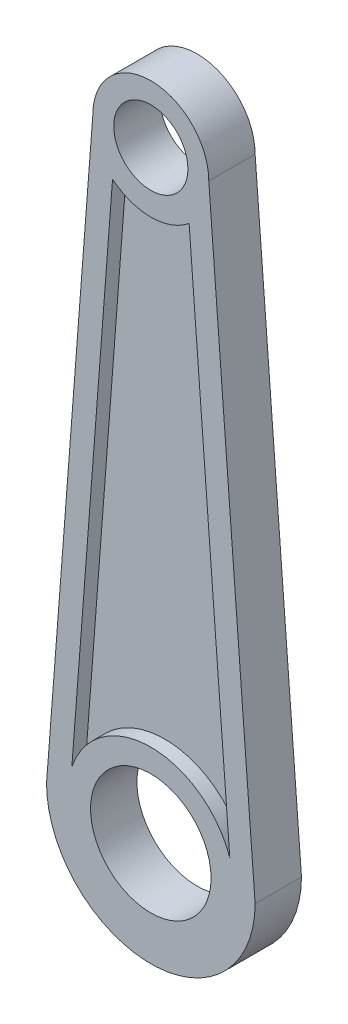
ISO-10303-21;
HEADER;
FILE_DESCRIPTION(('STEP AP214'),'2;1');
FILE_NAME('part.step','',(''),(''),'','','');
FILE_SCHEMA(('AUTOMOTIVE_DESIGN { 1 0 10303 214 1 1 1 1 }'));
ENDSEC;
DATA;
#1=APPLICATION_CONTEXT('core data for automotive mechanical design processes');
#2=APPLICATION_PROTOCOL_DEFINITION('international standard','automotive_design',2000,#1);
#3=PRODUCT_CONTEXT('',#1,'mechanical');
#4=PRODUCT('Part','Part','',(#3));
#5=PRODUCT_RELATED_PRODUCT_CATEGORY('part','',(#4));
#6=PRODUCT_DEFINITION_FORMATION('','',#4);
#7=PRODUCT_DEFINITION_CONTEXT('part definition',#1,'design');
#8=PRODUCT_DEFINITION('design','',#6,#7);
#9=PRODUCT_DEFINITION_SHAPE('','',#8);
#10=(LENGTH_UNIT() NAMED_UNIT(*) SI_UNIT(.MILLI.,.METRE.));
#11=(NAMED_UNIT(*) PLANE_ANGLE_UNIT() SI_UNIT($,.RADIAN.));
#12=(NAMED_UNIT(*) SI_UNIT($,.STERADIAN.) SOLID_ANGLE_UNIT());
#13=UNCERTAINTY_MEASURE_WITH_UNIT(LENGTH_MEASURE(1.E-05),#10,'distance_accuracy_value','');
#14=(GEOMETRIC_REPRESENTATION_CONTEXT(3) GLOBAL_UNCERTAINTY_ASSIGNED_CONTEXT((#13)) GLOBAL_UNIT_ASSIGNED_CONTEXT((#10,
#11,#12)) REPRESENTATION_CONTEXT('',''));
#15=CARTESIAN_POINT('',(0.,0.,0.));
#16=DIRECTION('',(0.,0.,1.));
#17=DIRECTION('',(1.,0.,0.));
#18=AXIS2_PLACEMENT_3D('',#15,#16,#17);
#19=CARTESIAN_POINT('',(0.,0.,5.));
#20=DIRECTION('',(0.,0.,1.));
#21=DIRECTION('',(1.,0.,0.));
#22=AXIS2_PLACEMENT_3D('',#19,#20,#21);
#23=PLANE('',#22);
#24=CARTESIAN_POINT('',(0.,130.,5.));
#25=DIRECTION('',(0.,0.,1.));
#26=DIRECTION('',(1.,0.,0.));
#27=AXIS2_PLACEMENT_3D('',#24,#25,#26);
#28=CIRCLE('',#27,8.);
#29=CARTESIAN_POINT('',(8.,130.,5.));
#30=VERTEX_POINT('',#29);
#31=EDGE_CURVE('E221',#30,#30,#28,.T.);
#32=ORIENTED_EDGE('',*,*,#31,.F.);
#33=EDGE_LOOP('',(#32));
#34=FACE_BOUND('',#33,.T.);
#35=CARTESIAN_POINT('',(0.,130.,5.));
#36=DIRECTION('',(0.,0.,1.));
#37=DIRECTION('',(1.,0.,0.));
#38=AXIS2_PLACEMENT_3D('',#35,#36,#37);
#39=CIRCLE('',#38,12.5);
#40=CARTESIAN_POINT('',(12.5,130.,5.));
#41=VERTEX_POINT('',#40);
#42=CARTESIAN_POINT('',(-12.5,130.,5.));
#43=VERTEX_POINT('',#42);
#44=EDGE_CURVE('E225',#41,#43,#39,.T.);
#45=ORIENTED_EDGE('',*,*,#44,.T.);
#46=DIRECTION('',(0.076696498884737,0.997054485501582,0.));
#47=VECTOR('',#46,1.);
#48=CARTESIAN_POINT('',(-22.3676470588235,1.72058823529412,5.));
#49=LINE('',#48,#47);
#50=CARTESIAN_POINT('',(-22.5,0.,5.));
#51=VERTEX_POINT('',#50);
#52=EDGE_CURVE('E229',#51,#43,#49,.T.);
#53=ORIENTED_EDGE('',*,*,#52,.F.);
#54=CARTESIAN_POINT('',(0.,0.,5.));
#55=DIRECTION('',(0.,0.,1.));
#56=DIRECTION('',(1.,0.,0.));
#57=AXIS2_PLACEMENT_3D('',#54,#55,#56);
#58=CIRCLE('',#57,22.5);
#59=CARTESIAN_POINT('',(22.5,0.,5.));
#60=VERTEX_POINT('',#59);
#61=EDGE_CURVE('E233',#51,#60,#58,.T.);
#62=ORIENTED_EDGE('',*,*,#61,.T.);
#63=DIRECTION('',(0.076696498884737,-0.997054485501582,0.));
#64=VECTOR('',#63,1.);
#65=CARTESIAN_POINT('',(22.3676470588235,1.72058823529412,5.));
#66=LINE('',#65,#64);
#67=EDGE_CURVE('E236',#41,#60,#66,.T.);
#68=ORIENTED_EDGE('',*,*,#67,.F.);
#69=EDGE_LOOP('',(#45,#53,#62,#68));
#70=FACE_BOUND('',#69,.T.);
#71=CARTESIAN_POINT('',(0.,0.,5.));
#72=DIRECTION('',(0.,0.,1.));
#73=DIRECTION('',(1.,0.,0.));
#74=AXIS2_PLACEMENT_3D('',#71,#72,#73);
#75=CIRCLE('',#74,13.);
#76=CARTESIAN_POINT('',(13.,0.,5.));
#77=VERTEX_POINT('',#76);
#78=EDGE_CURVE('E240',#77,#77,#75,.T.);
#79=ORIENTED_EDGE('',*,*,#78,.F.);
#80=EDGE_LOOP('',(#79));
#81=FACE_BOUND('',#80,.T.);
#82=DIRECTION('',(-0.076696498884737,-0.997054485501582,0.));
#83=VECTOR('',#82,1.);
#84=CARTESIAN_POINT('',(-8.25757800432226,119.959461891784,5.));
#85=LINE('',#84,#83);
#86=CARTESIAN_POINT('',(-8.25757800432226,119.959461891784,5.));
#87=VERTEX_POINT('',#86);
#88=CARTESIAN_POINT('',(-17.0388188270094,5.80333119685157,5.));
#89=VERTEX_POINT('',#88);
#90=EDGE_CURVE('E184',#87,#89,#85,.T.);
#91=ORIENTED_EDGE('',*,*,#90,.F.);
#92=CARTESIAN_POINT('',(0.,130.,5.));
#93=DIRECTION('',(0.,0.,1.));
#94=DIRECTION('',(1.,0.,0.));
#95=AXIS2_PLACEMENT_3D('',#92,#93,#94);
#96=CIRCLE('',#95,13.);
#97=CARTESIAN_POINT('',(8.25757800432226,119.959461891784,5.));
#98=VERTEX_POINT('',#97);
#99=EDGE_CURVE('E65',#87,#98,#96,.T.);
#100=ORIENTED_EDGE('',*,*,#99,.T.);
#101=DIRECTION('',(-0.076696498884737,0.997054485501582,0.));
#102=VECTOR('',#101,1.);
#103=CARTESIAN_POINT('',(17.0388188270094,5.80333119685158,5.));
#104=LINE('',#103,#102);
#105=CARTESIAN_POINT('',(17.0388188270094,5.80333119685158,5.));
#106=VERTEX_POINT('',#105);
#107=EDGE_CURVE('E198',#106,#98,#104,.T.);
#108=ORIENTED_EDGE('',*,*,#107,.F.);
#109=CARTESIAN_POINT('',(0.,0.,5.));
#110=DIRECTION('',(0.,0.,1.));
#111=DIRECTION('',(1.,0.,0.));
#112=AXIS2_PLACEMENT_3D('',#109,#110,#111);
#113=CIRCLE('',#112,18.);
#114=EDGE_CURVE('E202',#106,#89,#113,.T.);
#115=ORIENTED_EDGE('',*,*,#114,.T.);
#116=EDGE_LOOP('',(#91,#100,#108,#115));
#117=FACE_BOUND('',#116,.T.);
#118=ADVANCED_FACE('F41',(#34,#70,#81,#117),#23,.T.);
#119=CARTESIAN_POINT('',(0.,130.,5.));
#120=DIRECTION('',(0.,0.,-1.));
#121=DIRECTION('',(-1.,0.,0.));
#122=AXIS2_PLACEMENT_3D('',#119,#120,#121);
#123=CYLINDRICAL_SURFACE('',#122,12.5);
#124=CARTESIAN_POINT('',(0.,130.,-5.));
#125=DIRECTION('',(0.,0.,1.));
#126=DIRECTION('',(1.,0.,0.));
#127=AXIS2_PLACEMENT_3D('',#124,#125,#126);
#128=CIRCLE('',#127,12.5);
#129=CARTESIAN_POINT('',(12.5,130.,-5.));
#130=VERTEX_POINT('',#129);
#131=CARTESIAN_POINT('',(-12.5,130.,-5.));
#132=VERTEX_POINT('',#131);
#133=EDGE_CURVE('E248',#130,#132,#128,.T.);
#134=ORIENTED_EDGE('',*,*,#133,.T.);
#135=DIRECTION('',(0.,0.,-1.));
#136=VECTOR('',#135,1.);
#137=CARTESIAN_POINT('',(-12.5,130.,5.));
#138=LINE('',#137,#136);
#139=EDGE_CURVE('E11',#43,#132,#138,.T.);
#140=ORIENTED_EDGE('',*,*,#139,.F.);
#141=ORIENTED_EDGE('',*,*,#44,.F.);
#142=DIRECTION('',(0.,0.,-1.));
#143=VECTOR('',#142,1.);
#144=CARTESIAN_POINT('',(12.5,130.,5.));
#145=LINE('',#144,#143);
#146=EDGE_CURVE('E244',#41,#130,#145,.T.);
#147=ORIENTED_EDGE('',*,*,#146,.T.);
#148=EDGE_LOOP('',(#134,#140,#141,#147));
#149=FACE_BOUND('',#148,.T.);
#150=ADVANCED_FACE('F289',(#149),#123,.T.);
#151=CARTESIAN_POINT('',(-22.3676470588235,1.72058823529412,5.));
#152=DIRECTION('',(-0.997054485501582,0.076696498884737,0.));
#153=DIRECTION('',(-0.076696498884737,-0.997054485501582,0.));
#154=AXIS2_PLACEMENT_3D('',#151,#152,#153);
#155=PLANE('',#154);
#156=DIRECTION('',(0.076696498884737,0.997054485501582,0.));
#157=VECTOR('',#156,1.);
#158=CARTESIAN_POINT('',(-22.3676470588235,1.72058823529412,-5.));
#159=LINE('',#158,#157);
#160=CARTESIAN_POINT('',(-22.5,0.,-5.));
#161=VERTEX_POINT('',#160);
#162=EDGE_CURVE('E252',#161,#132,#159,.T.);
#163=ORIENTED_EDGE('',*,*,#162,.F.);
#164=DIRECTION('',(0.,0.,-1.));
#165=VECTOR('',#164,1.);
#166=CARTESIAN_POINT('',(-22.5,0.,5.));
#167=LINE('',#166,#165);
#168=EDGE_CURVE('E50',#51,#161,#167,.T.);
#169=ORIENTED_EDGE('',*,*,#168,.F.);
#170=ORIENTED_EDGE('',*,*,#52,.T.);
#171=ORIENTED_EDGE('',*,*,#139,.T.);
#172=EDGE_LOOP('',(#163,#169,#170,#171));
#173=FACE_BOUND('',#172,.T.);
#174=ADVANCED_FACE('F285',(#173),#155,.T.);
#175=CARTESIAN_POINT('',(0.,0.,5.));
#176=DIRECTION('',(0.,0.,-1.));
#177=DIRECTION('',(-1.,0.,0.));
#178=AXIS2_PLACEMENT_3D('',#175,#176,#177);
#179=CYLINDRICAL_SURFACE('',#178,22.5);
#180=CARTESIAN_POINT('',(0.,0.,-5.));
#181=DIRECTION('',(0.,0.,1.));
#182=DIRECTION('',(1.,0.,0.));
#183=AXIS2_PLACEMENT_3D('',#180,#181,#182);
#184=CIRCLE('',#183,22.5);
#185=CARTESIAN_POINT('',(22.5,0.,-5.));
#186=VERTEX_POINT('',#185);
#187=EDGE_CURVE('E256',#161,#186,#184,.T.);
#188=ORIENTED_EDGE('',*,*,#187,.T.);
#189=DIRECTION('',(0.,0.,-1.));
#190=VECTOR('',#189,1.);
#191=CARTESIAN_POINT('',(22.5,0.,5.));
#192=LINE('',#191,#190);
#193=EDGE_CURVE('E269',#60,#186,#192,.T.);
#194=ORIENTED_EDGE('',*,*,#193,.F.);
#195=ORIENTED_EDGE('',*,*,#61,.F.);
#196=ORIENTED_EDGE('',*,*,#168,.T.);
#197=EDGE_LOOP('',(#188,#194,#195,#196));
#198=FACE_BOUND('',#197,.T.);
#199=ADVANCED_FACE('F275',(#198),#179,.T.);
#200=CARTESIAN_POINT('',(22.3676470588235,1.72058823529412,5.));
#201=DIRECTION('',(0.997054485501582,0.076696498884737,0.));
#202=DIRECTION('',(-0.076696498884737,0.997054485501582,0.));
#203=AXIS2_PLACEMENT_3D('',#200,#201,#202);
#204=PLANE('',#203);
#205=DIRECTION('',(0.076696498884737,-0.997054485501582,0.));
#206=VECTOR('',#205,1.);
#207=CARTESIAN_POINT('',(22.3676470588235,1.72058823529412,-5.));
#208=LINE('',#207,#206);
#209=EDGE_CURVE('E260',#130,#186,#208,.T.);
#210=ORIENTED_EDGE('',*,*,#209,.F.);
#211=ORIENTED_EDGE('',*,*,#146,.F.);
#212=ORIENTED_EDGE('',*,*,#67,.T.);
#213=ORIENTED_EDGE('',*,*,#193,.T.);
#214=EDGE_LOOP('',(#210,#211,#212,#213));
#215=FACE_BOUND('',#214,.T.);
#216=ADVANCED_FACE('F291',(#215),#204,.T.);
#217=CARTESIAN_POINT('',(0.,130.,5.));
#218=DIRECTION('',(0.,0.,-1.));
#219=DIRECTION('',(-1.,0.,0.));
#220=AXIS2_PLACEMENT_3D('',#217,#218,#219);
#221=CYLINDRICAL_SURFACE('',#220,8.);
#222=ORIENTED_EDGE('',*,*,#31,.T.);
#223=EDGE_LOOP('',(#222));
#224=FACE_BOUND('',#223,.T.);
#225=CARTESIAN_POINT('',(0.,130.,-5.));
#226=DIRECTION('',(0.,0.,1.));
#227=DIRECTION('',(1.,0.,0.));
#228=AXIS2_PLACEMENT_3D('',#225,#226,#227);
#229=CIRCLE('',#228,8.);
#230=CARTESIAN_POINT('',(8.,130.,-5.));
#231=VERTEX_POINT('',#230);
#232=EDGE_CURVE('E220',#231,#231,#229,.T.);
#233=ORIENTED_EDGE('',*,*,#232,.F.);
#234=EDGE_LOOP('',(#233));
#235=FACE_BOUND('',#234,.T.);
#236=ADVANCED_FACE('F43',(#224,#235),#221,.F.);
#237=CARTESIAN_POINT('',(0.,0.,5.));
#238=DIRECTION('',(0.,0.,-1.));
#239=DIRECTION('',(-1.,0.,0.));
#240=AXIS2_PLACEMENT_3D('',#237,#238,#239);
#241=CYLINDRICAL_SURFACE('',#240,13.);
#242=ORIENTED_EDGE('',*,*,#78,.T.);
#243=EDGE_LOOP('',(#242));
#244=FACE_BOUND('',#243,.T.);
#245=CARTESIAN_POINT('',(0.,0.,-5.));
#246=DIRECTION('',(0.,0.,1.));
#247=DIRECTION('',(1.,0.,0.));
#248=AXIS2_PLACEMENT_3D('',#245,#246,#247);
#249=CIRCLE('',#248,13.);
#250=CARTESIAN_POINT('',(13.,0.,-5.));
#251=VERTEX_POINT('',#250);
#252=EDGE_CURVE('E226',#251,#251,#249,.T.);
#253=ORIENTED_EDGE('',*,*,#252,.F.);
#254=EDGE_LOOP('',(#253));
#255=FACE_BOUND('',#254,.T.);
#256=ADVANCED_FACE('F332',(#244,#255),#241,.F.);
#257=CARTESIAN_POINT('',(0.,0.,-5.));
#258=DIRECTION('',(0.,0.,1.));
#259=DIRECTION('',(1.,0.,0.));
#260=AXIS2_PLACEMENT_3D('',#257,#258,#259);
#261=PLANE('',#260);
#262=DIRECTION('',(-0.076696498884737,0.997054485501582,0.));
#263=VECTOR('',#262,1.);
#264=CARTESIAN_POINT('',(17.0388188270094,5.80333119685158,-5.));
#265=LINE('',#264,#263);
#266=CARTESIAN_POINT('',(17.0388188270094,5.80333119685158,-5.));
#267=VERTEX_POINT('',#266);
#268=CARTESIAN_POINT('',(8.25757800432225,119.959461891784,-5.));
#269=VERTEX_POINT('',#268);
#270=EDGE_CURVE('E154',#267,#269,#265,.T.);
#271=ORIENTED_EDGE('',*,*,#270,.T.);
#272=CARTESIAN_POINT('',(0.,130.,-5.));
#273=DIRECTION('',(0.,0.,1.));
#274=DIRECTION('',(1.,0.,0.));
#275=AXIS2_PLACEMENT_3D('',#272,#273,#274);
#276=CIRCLE('',#275,13.);
#277=CARTESIAN_POINT('',(-8.25757800432226,119.959461891784,-5.));
#278=VERTEX_POINT('',#277);
#279=EDGE_CURVE('E57',#278,#269,#276,.T.);
#280=ORIENTED_EDGE('',*,*,#279,.F.);
#281=DIRECTION('',(-0.076696498884737,-0.997054485501582,0.));
#282=VECTOR('',#281,1.);
#283=CARTESIAN_POINT('',(-8.25757800432226,119.959461891784,-5.));
#284=LINE('',#283,#282);
#285=CARTESIAN_POINT('',(-17.0388188270094,5.80333119685157,-5.));
#286=VERTEX_POINT('',#285);
#287=EDGE_CURVE('E136',#278,#286,#284,.T.);
#288=ORIENTED_EDGE('',*,*,#287,.T.);
#289=CARTESIAN_POINT('',(0.,0.,-5.));
#290=DIRECTION('',(0.,0.,1.));
#291=DIRECTION('',(1.,0.,0.));
#292=AXIS2_PLACEMENT_3D('',#289,#290,#291);
#293=CIRCLE('',#292,18.);
#294=EDGE_CURVE('E158',#267,#286,#293,.T.);
#295=ORIENTED_EDGE('',*,*,#294,.F.);
#296=EDGE_LOOP('',(#271,#280,#288,#295));
#297=FACE_BOUND('',#296,.T.);
#298=ORIENTED_EDGE('',*,*,#232,.T.);
#299=EDGE_LOOP('',(#298));
#300=FACE_BOUND('',#299,.T.);
#301=ORIENTED_EDGE('',*,*,#133,.F.);
#302=ORIENTED_EDGE('',*,*,#209,.T.);
#303=ORIENTED_EDGE('',*,*,#187,.F.);
#304=ORIENTED_EDGE('',*,*,#162,.T.);
#305=EDGE_LOOP('',(#301,#302,#303,#304));
#306=FACE_BOUND('',#305,.T.);
#307=ORIENTED_EDGE('',*,*,#252,.T.);
#308=EDGE_LOOP('',(#307));
#309=FACE_BOUND('',#308,.T.);
#310=ADVANCED_FACE('F282',(#297,#300,#306,#309),#261,.F.);
#311=CARTESIAN_POINT('',(0.,130.,2.));
#312=DIRECTION('',(0.,0.,1.));
#313=DIRECTION('',(1.,0.,0.));
#314=AXIS2_PLACEMENT_3D('',#311,#312,#313);
#315=CYLINDRICAL_SURFACE('',#314,13.);
#316=ORIENTED_EDGE('',*,*,#99,.F.);
#317=DIRECTION('',(0.,0.,1.));
#318=VECTOR('',#317,1.);
#319=CARTESIAN_POINT('',(-8.25757800432226,119.959461891784,2.));
#320=LINE('',#319,#318);
#321=CARTESIAN_POINT('',(-8.25757800432226,119.959461891784,2.));
#322=VERTEX_POINT('',#321);
#323=EDGE_CURVE('E195',#322,#87,#320,.T.);
#324=ORIENTED_EDGE('',*,*,#323,.F.);
#325=CARTESIAN_POINT('',(0.,130.,2.));
#326=DIRECTION('',(0.,0.,1.));
#327=DIRECTION('',(1.,0.,0.));
#328=AXIS2_PLACEMENT_3D('',#325,#326,#327);
#329=CIRCLE('',#328,13.);
#330=CARTESIAN_POINT('',(8.25757800432226,119.959461891784,2.));
#331=VERTEX_POINT('',#330);
#332=EDGE_CURVE('E180',#322,#331,#329,.T.);
#333=ORIENTED_EDGE('',*,*,#332,.T.);
#334=DIRECTION('',(0.,0.,1.));
#335=VECTOR('',#334,1.);
#336=CARTESIAN_POINT('',(8.25757800432226,119.959461891784,2.));
#337=LINE('',#336,#335);
#338=EDGE_CURVE('E217',#331,#98,#337,.T.);
#339=ORIENTED_EDGE('',*,*,#338,.T.);
#340=EDGE_LOOP('',(#316,#324,#333,#339));
#341=FACE_BOUND('',#340,.T.);
#342=ADVANCED_FACE('F308',(#341),#315,.T.);
#343=CARTESIAN_POINT('',(17.0388188270094,5.80333119685158,2.));
#344=DIRECTION('',(0.997054485501582,0.076696498884737,0.));
#345=DIRECTION('',(-0.076696498884737,0.997054485501582,0.));
#346=AXIS2_PLACEMENT_3D('',#343,#344,#345);
#347=PLANE('',#346);
#348=ORIENTED_EDGE('',*,*,#107,.T.);
#349=ORIENTED_EDGE('',*,*,#338,.F.);
#350=DIRECTION('',(-0.076696498884737,0.997054485501582,0.));
#351=VECTOR('',#350,1.);
#352=CARTESIAN_POINT('',(17.0388188270094,5.80333119685158,2.));
#353=LINE('',#352,#351);
#354=CARTESIAN_POINT('',(17.0388188270094,5.80333119685158,2.));
#355=VERTEX_POINT('',#354);
#356=EDGE_CURVE('E183',#355,#331,#353,.T.);
#357=ORIENTED_EDGE('',*,*,#356,.F.);
#358=DIRECTION('',(0.,0.,1.));
#359=VECTOR('',#358,1.);
#360=CARTESIAN_POINT('',(17.0388188270094,5.80333119685158,2.));
#361=LINE('',#360,#359);
#362=EDGE_CURVE('E214',#355,#106,#361,.T.);
#363=ORIENTED_EDGE('',*,*,#362,.T.);
#364=EDGE_LOOP('',(#348,#349,#357,#363));
#365=FACE_BOUND('',#364,.T.);
#366=ADVANCED_FACE('F315',(#365),#347,.F.);
#367=CARTESIAN_POINT('',(0.,0.,2.));
#368=DIRECTION('',(0.,0.,1.));
#369=DIRECTION('',(1.,0.,0.));
#370=AXIS2_PLACEMENT_3D('',#367,#368,#369);
#371=CYLINDRICAL_SURFACE('',#370,18.);
#372=ORIENTED_EDGE('',*,*,#114,.F.);
#373=ORIENTED_EDGE('',*,*,#362,.F.);
#374=CARTESIAN_POINT('',(0.,0.,2.));
#375=DIRECTION('',(0.,0.,1.));
#376=DIRECTION('',(1.,0.,0.));
#377=AXIS2_PLACEMENT_3D('',#374,#375,#376);
#378=CIRCLE('',#377,18.);
#379=CARTESIAN_POINT('',(-17.0388188270094,5.80333119685157,2.));
#380=VERTEX_POINT('',#379);
#381=EDGE_CURVE('E188',#355,#380,#378,.T.);
#382=ORIENTED_EDGE('',*,*,#381,.T.);
#383=DIRECTION('',(0.,0.,1.));
#384=VECTOR('',#383,1.);
#385=CARTESIAN_POINT('',(-17.0388188270094,5.80333119685157,2.));
#386=LINE('',#385,#384);
#387=EDGE_CURVE('E211',#380,#89,#386,.T.);
#388=ORIENTED_EDGE('',*,*,#387,.T.);
#389=EDGE_LOOP('',(#372,#373,#382,#388));
#390=FACE_BOUND('',#389,.T.);
#391=ADVANCED_FACE('F317',(#390),#371,.T.);
#392=CARTESIAN_POINT('',(-8.25757800432226,119.959461891784,2.));
#393=DIRECTION('',(-0.997054485501581,0.076696498884737,0.));
#394=DIRECTION('',(-0.076696498884737,-0.997054485501582,0.));
#395=AXIS2_PLACEMENT_3D('',#392,#393,#394);
#396=PLANE('',#395);
#397=ORIENTED_EDGE('',*,*,#90,.T.);
#398=ORIENTED_EDGE('',*,*,#387,.F.);
#399=DIRECTION('',(-0.076696498884737,-0.997054485501582,0.));
#400=VECTOR('',#399,1.);
#401=CARTESIAN_POINT('',(-8.25757800432226,119.959461891784,2.));
#402=LINE('',#401,#400);
#403=EDGE_CURVE('E191',#322,#380,#402,.T.);
#404=ORIENTED_EDGE('',*,*,#403,.F.);
#405=ORIENTED_EDGE('',*,*,#323,.T.);
#406=EDGE_LOOP('',(#397,#398,#404,#405));
#407=FACE_BOUND('',#406,.T.);
#408=ADVANCED_FACE('F305',(#407),#396,.F.);
#409=CARTESIAN_POINT('',(0.,130.,2.));
#410=DIRECTION('',(0.,0.,1.));
#411=DIRECTION('',(1.,0.,0.));
#412=AXIS2_PLACEMENT_3D('',#409,#410,#411);
#413=PLANE('',#412);
#414=ORIENTED_EDGE('',*,*,#332,.F.);
#415=ORIENTED_EDGE('',*,*,#403,.T.);
#416=ORIENTED_EDGE('',*,*,#381,.F.);
#417=ORIENTED_EDGE('',*,*,#356,.T.);
#418=EDGE_LOOP('',(#414,#415,#416,#417));
#419=FACE_BOUND('',#418,.T.);
#420=ADVANCED_FACE('F311',(#419),#413,.T.);
#421=CARTESIAN_POINT('',(0.,130.,-2.));
#422=DIRECTION('',(0.,0.,-1.));
#423=DIRECTION('',(-1.,0.,0.));
#424=AXIS2_PLACEMENT_3D('',#421,#422,#423);
#425=CYLINDRICAL_SURFACE('',#424,13.);
#426=ORIENTED_EDGE('',*,*,#279,.T.);
#427=DIRECTION('',(0.,0.,-1.));
#428=VECTOR('',#427,1.);
#429=CARTESIAN_POINT('',(8.25757800432226,119.959461891784,-2.));
#430=LINE('',#429,#428);
#431=CARTESIAN_POINT('',(8.25757800432226,119.959461891784,-2.));
#432=VERTEX_POINT('',#431);
#433=EDGE_CURVE('E152',#432,#269,#430,.T.);
#434=ORIENTED_EDGE('',*,*,#433,.F.);
#435=CARTESIAN_POINT('',(0.,130.,-2.));
#436=DIRECTION('',(0.,0.,1.));
#437=DIRECTION('',(1.,0.,0.));
#438=AXIS2_PLACEMENT_3D('',#435,#436,#437);
#439=CIRCLE('',#438,13.);
#440=CARTESIAN_POINT('',(-8.25757800432226,119.959461891784,-2.));
#441=VERTEX_POINT('',#440);
#442=EDGE_CURVE('E146',#441,#432,#439,.T.);
#443=ORIENTED_EDGE('',*,*,#442,.F.);
#444=DIRECTION('',(0.,0.,-1.));
#445=VECTOR('',#444,1.);
#446=CARTESIAN_POINT('',(-8.25757800432226,119.959461891784,-2.));
#447=LINE('',#446,#445);
#448=EDGE_CURVE('E130',#441,#278,#447,.T.);
#449=ORIENTED_EDGE('',*,*,#448,.T.);
#450=EDGE_LOOP('',(#426,#434,#443,#449));
#451=FACE_BOUND('',#450,.T.);
#452=ADVANCED_FACE('F151',(#451),#425,.T.);
#453=CARTESIAN_POINT('',(-8.25757800432226,119.959461891784,-2.));
#454=DIRECTION('',(0.997054485501581,-0.076696498884737,0.));
#455=DIRECTION('',(0.076696498884737,0.997054485501582,0.));
#456=AXIS2_PLACEMENT_3D('',#453,#454,#455);
#457=PLANE('',#456);
#458=ORIENTED_EDGE('',*,*,#287,.F.);
#459=ORIENTED_EDGE('',*,*,#448,.F.);
#460=DIRECTION('',(-0.076696498884737,-0.997054485501582,0.));
#461=VECTOR('',#460,1.);
#462=CARTESIAN_POINT('',(-8.25757800432226,119.959461891784,-2.));
#463=LINE('',#462,#461);
#464=CARTESIAN_POINT('',(-17.0388188270094,5.80333119685157,-2.));
#465=VERTEX_POINT('',#464);
#466=EDGE_CURVE('E133',#441,#465,#463,.T.);
#467=ORIENTED_EDGE('',*,*,#466,.T.);
#468=DIRECTION('',(0.,0.,-1.));
#469=VECTOR('',#468,1.);
#470=CARTESIAN_POINT('',(-17.0388188270094,5.80333119685157,-2.));
#471=LINE('',#470,#469);
#472=EDGE_CURVE('E139',#465,#286,#471,.T.);
#473=ORIENTED_EDGE('',*,*,#472,.T.);
#474=EDGE_LOOP('',(#458,#459,#467,#473));
#475=FACE_BOUND('',#474,.T.);
#476=ADVANCED_FACE('F132',(#475),#457,.T.);
#477=CARTESIAN_POINT('',(0.,0.,-2.));
#478=DIRECTION('',(0.,0.,-1.));
#479=DIRECTION('',(-1.,0.,0.));
#480=AXIS2_PLACEMENT_3D('',#477,#478,#479);
#481=CYLINDRICAL_SURFACE('',#480,18.);
#482=ORIENTED_EDGE('',*,*,#294,.T.);
#483=ORIENTED_EDGE('',*,*,#472,.F.);
#484=CARTESIAN_POINT('',(0.,0.,-2.));
#485=DIRECTION('',(0.,0.,1.));
#486=DIRECTION('',(1.,0.,0.));
#487=AXIS2_PLACEMENT_3D('',#484,#485,#486);
#488=CIRCLE('',#487,18.);
#489=CARTESIAN_POINT('',(17.0388188270094,5.80333119685158,-2.));
#490=VERTEX_POINT('',#489);
#491=EDGE_CURVE('E148',#490,#465,#488,.T.);
#492=ORIENTED_EDGE('',*,*,#491,.F.);
#493=DIRECTION('',(0.,0.,-1.));
#494=VECTOR('',#493,1.);
#495=CARTESIAN_POINT('',(17.0388188270094,5.80333119685158,-2.));
#496=LINE('',#495,#494);
#497=EDGE_CURVE('E175',#490,#267,#496,.T.);
#498=ORIENTED_EDGE('',*,*,#497,.T.);
#499=EDGE_LOOP('',(#482,#483,#492,#498));
#500=FACE_BOUND('',#499,.T.);
#501=ADVANCED_FACE('F412',(#500),#481,.T.);
#502=CARTESIAN_POINT('',(17.0388188270094,5.80333119685158,-2.));
#503=DIRECTION('',(-0.997054485501582,-0.076696498884737,0.));
#504=DIRECTION('',(0.076696498884737,-0.997054485501582,0.));
#505=AXIS2_PLACEMENT_3D('',#502,#503,#504);
#506=PLANE('',#505);
#507=ORIENTED_EDGE('',*,*,#270,.F.);
#508=ORIENTED_EDGE('',*,*,#497,.F.);
#509=DIRECTION('',(-0.076696498884737,0.997054485501582,0.));
#510=VECTOR('',#509,1.);
#511=CARTESIAN_POINT('',(17.0388188270094,5.80333119685158,-2.));
#512=LINE('',#511,#510);
#513=EDGE_CURVE('E163',#490,#432,#512,.T.);
#514=ORIENTED_EDGE('',*,*,#513,.T.);
#515=ORIENTED_EDGE('',*,*,#433,.T.);
#516=EDGE_LOOP('',(#507,#508,#514,#515));
#517=FACE_BOUND('',#516,.T.);
#518=ADVANCED_FACE('F419',(#517),#506,.T.);
#519=CARTESIAN_POINT('',(0.,130.,-2.));
#520=DIRECTION('',(0.,0.,-1.));
#521=DIRECTION('',(1.,0.,0.));
#522=AXIS2_PLACEMENT_3D('',#519,#520,#521);
#523=PLANE('',#522);
#524=ORIENTED_EDGE('',*,*,#442,.T.);
#525=ORIENTED_EDGE('',*,*,#513,.F.);
#526=ORIENTED_EDGE('',*,*,#491,.T.);
#527=ORIENTED_EDGE('',*,*,#466,.F.);
#528=EDGE_LOOP('',(#524,#525,#526,#527));
#529=FACE_BOUND('',#528,.T.);
#530=ADVANCED_FACE('F144',(#529),#523,.T.);
#531=CLOSED_SHELL('',(#118,#150,#174,#199,#216,#236,#256,#310,#342,#366,#391,#408,#420,#452,
#476,#501,#518,#530));
#532=MANIFOLD_SOLID_BREP('B2',#531);
#533=ADVANCED_BREP_SHAPE_REPRESENTATION('',(#18,#532),#14);
#534=SHAPE_DEFINITION_REPRESENTATION(#9,#533);
ENDSEC;
END-ISO-10303-21;
